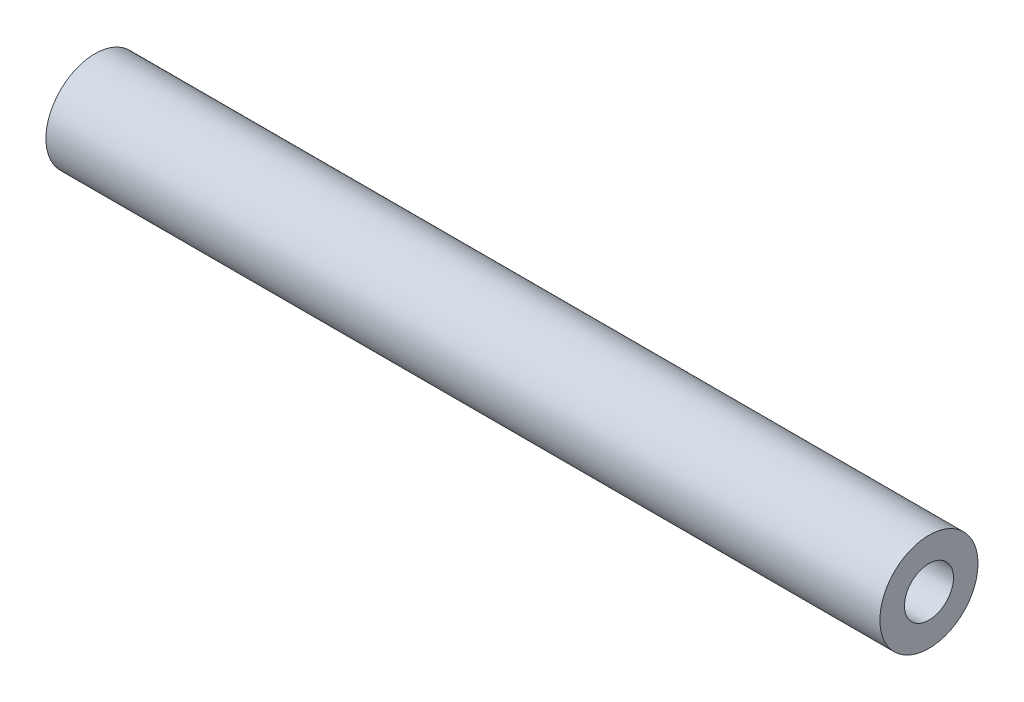
ISO-10303-21;
HEADER;
FILE_DESCRIPTION(('STEP AP214'),'2;1');
FILE_NAME('part.step','',(''),(''),'','','');
FILE_SCHEMA(('AUTOMOTIVE_DESIGN { 1 0 10303 214 1 1 1 1 }'));
ENDSEC;
DATA;
#1=APPLICATION_CONTEXT('core data for automotive mechanical design processes');
#2=APPLICATION_PROTOCOL_DEFINITION('international standard','automotive_design',2000,#1);
#3=PRODUCT_CONTEXT('',#1,'mechanical');
#4=PRODUCT('Part','Part','',(#3));
#5=PRODUCT_RELATED_PRODUCT_CATEGORY('part','',(#4));
#6=PRODUCT_DEFINITION_FORMATION('','',#4);
#7=PRODUCT_DEFINITION_CONTEXT('part definition',#1,'design');
#8=PRODUCT_DEFINITION('design','',#6,#7);
#9=PRODUCT_DEFINITION_SHAPE('','',#8);
#10=(LENGTH_UNIT() NAMED_UNIT(*) SI_UNIT(.MILLI.,.METRE.));
#11=(NAMED_UNIT(*) PLANE_ANGLE_UNIT() SI_UNIT($,.RADIAN.));
#12=(NAMED_UNIT(*) SI_UNIT($,.STERADIAN.) SOLID_ANGLE_UNIT());
#13=UNCERTAINTY_MEASURE_WITH_UNIT(LENGTH_MEASURE(1.E-05),#10,'distance_accuracy_value','');
#14=(GEOMETRIC_REPRESENTATION_CONTEXT(3) GLOBAL_UNCERTAINTY_ASSIGNED_CONTEXT((#13)) GLOBAL_UNIT_ASSIGNED_CONTEXT((#10,
#11,#12)) REPRESENTATION_CONTEXT('',''));
#15=CARTESIAN_POINT('',(0.,0.,0.));
#16=DIRECTION('',(0.,0.,1.));
#17=DIRECTION('',(1.,0.,0.));
#18=AXIS2_PLACEMENT_3D('',#15,#16,#17);
#19=CARTESIAN_POINT('',(85.,0.,0.));
#20=DIRECTION('',(1.,0.,0.));
#21=DIRECTION('',(0.,0.,-1.));
#22=AXIS2_PLACEMENT_3D('',#19,#20,#21);
#23=PLANE('',#22);
#24=CARTESIAN_POINT('',(85.,0.,0.));
#25=DIRECTION('',(1.,0.,0.));
#26=DIRECTION('',(0.,0.,-1.));
#27=AXIS2_PLACEMENT_3D('',#24,#25,#26);
#28=CIRCLE('',#27,5.);
#29=CARTESIAN_POINT('',(85.,0.,-5.));
#30=VERTEX_POINT('',#29);
#31=EDGE_CURVE('E10',#30,#30,#28,.T.);
#32=ORIENTED_EDGE('',*,*,#31,.T.);
#33=EDGE_LOOP('',(#32));
#34=FACE_BOUND('',#33,.T.);
#35=CARTESIAN_POINT('',(85.,0.,0.));
#36=DIRECTION('',(1.,0.,0.));
#37=DIRECTION('',(0.,0.,-1.));
#38=AXIS2_PLACEMENT_3D('',#35,#36,#37);
#39=CIRCLE('',#38,2.5);
#40=CARTESIAN_POINT('',(85.,0.,-2.5));
#41=VERTEX_POINT('',#40);
#42=EDGE_CURVE('E48',#41,#41,#39,.T.);
#43=ORIENTED_EDGE('',*,*,#42,.F.);
#44=EDGE_LOOP('',(#43));
#45=FACE_BOUND('',#44,.T.);
#46=ADVANCED_FACE('F40',(#34,#45),#23,.T.);
#47=CARTESIAN_POINT('',(0.,0.,0.));
#48=DIRECTION('',(1.,0.,0.));
#49=DIRECTION('',(0.,0.,-1.));
#50=AXIS2_PLACEMENT_3D('',#47,#48,#49);
#51=PLANE('',#50);
#52=CARTESIAN_POINT('',(0.,0.,0.));
#53=DIRECTION('',(1.,0.,0.));
#54=DIRECTION('',(0.,0.,-1.));
#55=AXIS2_PLACEMENT_3D('',#52,#53,#54);
#56=CIRCLE('',#55,5.);
#57=CARTESIAN_POINT('',(0.,0.,-5.));
#58=VERTEX_POINT('',#57);
#59=EDGE_CURVE('E41',#58,#58,#56,.T.);
#60=ORIENTED_EDGE('',*,*,#59,.F.);
#61=EDGE_LOOP('',(#60));
#62=FACE_BOUND('',#61,.T.);
#63=CARTESIAN_POINT('',(0.,0.,0.));
#64=DIRECTION('',(1.,0.,0.));
#65=DIRECTION('',(0.,0.,-1.));
#66=AXIS2_PLACEMENT_3D('',#63,#64,#65);
#67=CIRCLE('',#66,2.5);
#68=CARTESIAN_POINT('',(0.,0.,-2.5));
#69=VERTEX_POINT('',#68);
#70=EDGE_CURVE('E49',#69,#69,#67,.T.);
#71=ORIENTED_EDGE('',*,*,#70,.T.);
#72=EDGE_LOOP('',(#71));
#73=FACE_BOUND('',#72,.T.);
#74=ADVANCED_FACE('F58',(#62,#73),#51,.F.);
#75=CARTESIAN_POINT('',(85.,0.,0.));
#76=DIRECTION('',(-1.,0.,0.));
#77=DIRECTION('',(0.,0.,1.));
#78=AXIS2_PLACEMENT_3D('',#75,#76,#77);
#79=CYLINDRICAL_SURFACE('',#78,5.);
#80=ORIENTED_EDGE('',*,*,#31,.F.);
#81=EDGE_LOOP('',(#80));
#82=FACE_BOUND('',#81,.T.);
#83=ORIENTED_EDGE('',*,*,#59,.T.);
#84=EDGE_LOOP('',(#83));
#85=FACE_BOUND('',#84,.T.);
#86=ADVANCED_FACE('F39',(#82,#85),#79,.T.);
#87=CARTESIAN_POINT('',(85.,0.,0.));
#88=DIRECTION('',(-1.,0.,0.));
#89=DIRECTION('',(0.,0.,1.));
#90=AXIS2_PLACEMENT_3D('',#87,#88,#89);
#91=CYLINDRICAL_SURFACE('',#90,2.5);
#92=ORIENTED_EDGE('',*,*,#42,.T.);
#93=EDGE_LOOP('',(#92));
#94=FACE_BOUND('',#93,.T.);
#95=ORIENTED_EDGE('',*,*,#70,.F.);
#96=EDGE_LOOP('',(#95));
#97=FACE_BOUND('',#96,.T.);
#98=ADVANCED_FACE('F57',(#94,#97),#91,.F.);
#99=CLOSED_SHELL('',(#46,#74,#86,#98));
#100=MANIFOLD_SOLID_BREP('B2',#99);
#101=ADVANCED_BREP_SHAPE_REPRESENTATION('',(#18,#100),#14);
#102=SHAPE_DEFINITION_REPRESENTATION(#9,#101);
ENDSEC;
END-ISO-10303-21;
